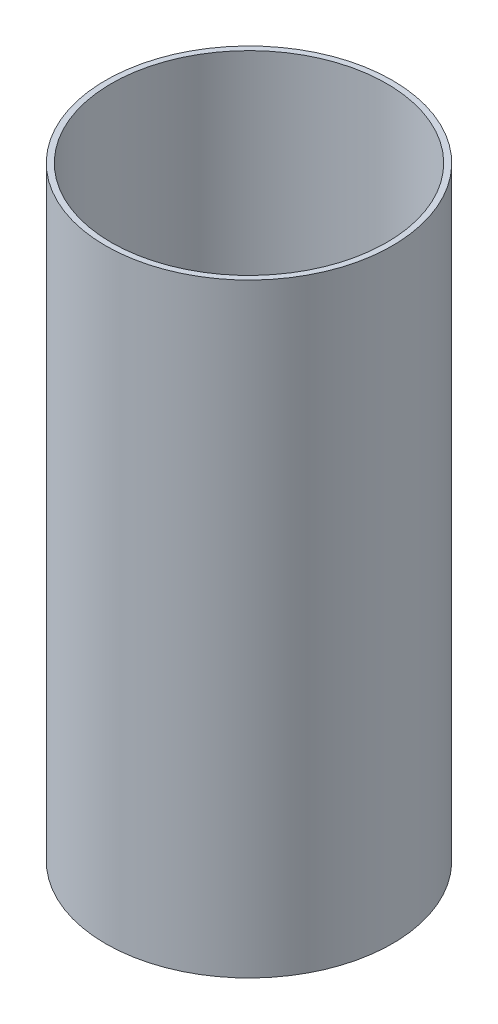
ISO-10303-21;
HEADER;
FILE_DESCRIPTION(('STEP AP214'),'2;1');
FILE_NAME('part.step','',(''),(''),'','','');
FILE_SCHEMA(('AUTOMOTIVE_DESIGN { 1 0 10303 214 1 1 1 1 }'));
ENDSEC;
DATA;
#1=APPLICATION_CONTEXT('core data for automotive mechanical design processes');
#2=APPLICATION_PROTOCOL_DEFINITION('international standard','automotive_design',2000,#1);
#3=PRODUCT_CONTEXT('',#1,'mechanical');
#4=PRODUCT('Part','Part','',(#3));
#5=PRODUCT_RELATED_PRODUCT_CATEGORY('part','',(#4));
#6=PRODUCT_DEFINITION_FORMATION('','',#4);
#7=PRODUCT_DEFINITION_CONTEXT('part definition',#1,'design');
#8=PRODUCT_DEFINITION('design','',#6,#7);
#9=PRODUCT_DEFINITION_SHAPE('','',#8);
#10=(LENGTH_UNIT() NAMED_UNIT(*) SI_UNIT(.MILLI.,.METRE.));
#11=(NAMED_UNIT(*) PLANE_ANGLE_UNIT() SI_UNIT($,.RADIAN.));
#12=(NAMED_UNIT(*) SI_UNIT($,.STERADIAN.) SOLID_ANGLE_UNIT());
#13=UNCERTAINTY_MEASURE_WITH_UNIT(LENGTH_MEASURE(1.E-05),#10,'distance_accuracy_value','');
#14=(GEOMETRIC_REPRESENTATION_CONTEXT(3) GLOBAL_UNCERTAINTY_ASSIGNED_CONTEXT((#13)) GLOBAL_UNIT_ASSIGNED_CONTEXT((#10,
#11,#12)) REPRESENTATION_CONTEXT('',''));
#15=CARTESIAN_POINT('',(0.,0.,0.));
#16=DIRECTION('',(0.,0.,1.));
#17=DIRECTION('',(1.,0.,0.));
#18=AXIS2_PLACEMENT_3D('',#15,#16,#17);
#19=CARTESIAN_POINT('',(0.,160.,0.));
#20=DIRECTION('',(0.,1.,0.));
#21=DIRECTION('',(0.,0.,1.));
#22=AXIS2_PLACEMENT_3D('',#19,#20,#21);
#23=PLANE('',#22);
#24=CARTESIAN_POINT('',(0.,160.,0.));
#25=DIRECTION('',(0.,1.,0.));
#26=DIRECTION('',(0.,0.,1.));
#27=AXIS2_PLACEMENT_3D('',#24,#25,#26);
#28=CIRCLE('',#27,37.95);
#29=CARTESIAN_POINT('',(0.,160.,37.95));
#30=VERTEX_POINT('',#29);
#31=EDGE_CURVE('E10',#30,#30,#28,.T.);
#32=ORIENTED_EDGE('',*,*,#31,.T.);
#33=EDGE_LOOP('',(#32));
#34=FACE_BOUND('',#33,.T.);
#35=CARTESIAN_POINT('',(0.,160.,0.));
#36=DIRECTION('',(0.,1.,0.));
#37=DIRECTION('',(0.,0.,1.));
#38=AXIS2_PLACEMENT_3D('',#35,#36,#37);
#39=CIRCLE('',#38,36.45);
#40=CARTESIAN_POINT('',(0.,160.,36.45));
#41=VERTEX_POINT('',#40);
#42=EDGE_CURVE('E43',#41,#41,#39,.T.);
#43=ORIENTED_EDGE('',*,*,#42,.F.);
#44=EDGE_LOOP('',(#43));
#45=FACE_BOUND('',#44,.T.);
#46=ADVANCED_FACE('F32',(#34,#45),#23,.T.);
#47=CARTESIAN_POINT('',(0.,0.,0.));
#48=DIRECTION('',(0.,1.,0.));
#49=DIRECTION('',(0.,0.,1.));
#50=AXIS2_PLACEMENT_3D('',#47,#48,#49);
#51=PLANE('',#50);
#52=CARTESIAN_POINT('',(0.,0.,0.));
#53=DIRECTION('',(0.,1.,0.));
#54=DIRECTION('',(0.,0.,1.));
#55=AXIS2_PLACEMENT_3D('',#52,#53,#54);
#56=CIRCLE('',#55,37.95);
#57=CARTESIAN_POINT('',(0.,0.,37.95));
#58=VERTEX_POINT('',#57);
#59=EDGE_CURVE('E36',#58,#58,#56,.T.);
#60=ORIENTED_EDGE('',*,*,#59,.F.);
#61=EDGE_LOOP('',(#60));
#62=FACE_BOUND('',#61,.T.);
#63=CARTESIAN_POINT('',(0.,0.,0.));
#64=DIRECTION('',(0.,1.,0.));
#65=DIRECTION('',(0.,0.,1.));
#66=AXIS2_PLACEMENT_3D('',#63,#64,#65);
#67=CIRCLE('',#66,36.45);
#68=CARTESIAN_POINT('',(0.,0.,36.45));
#69=VERTEX_POINT('',#68);
#70=EDGE_CURVE('E45',#69,#69,#67,.T.);
#71=ORIENTED_EDGE('',*,*,#70,.T.);
#72=EDGE_LOOP('',(#71));
#73=FACE_BOUND('',#72,.T.);
#74=ADVANCED_FACE('F55',(#62,#73),#51,.F.);
#75=CARTESIAN_POINT('',(0.,160.,0.));
#76=DIRECTION('',(0.,-1.,0.));
#77=DIRECTION('',(0.,0.,-1.));
#78=AXIS2_PLACEMENT_3D('',#75,#76,#77);
#79=CYLINDRICAL_SURFACE('',#78,37.95);
#80=ORIENTED_EDGE('',*,*,#31,.F.);
#81=EDGE_LOOP('',(#80));
#82=FACE_BOUND('',#81,.T.);
#83=ORIENTED_EDGE('',*,*,#59,.T.);
#84=EDGE_LOOP('',(#83));
#85=FACE_BOUND('',#84,.T.);
#86=ADVANCED_FACE('F34',(#82,#85),#79,.T.);
#87=CARTESIAN_POINT('',(0.,160.,0.));
#88=DIRECTION('',(0.,-1.,0.));
#89=DIRECTION('',(0.,0.,-1.));
#90=AXIS2_PLACEMENT_3D('',#87,#88,#89);
#91=CYLINDRICAL_SURFACE('',#90,36.45);
#92=ORIENTED_EDGE('',*,*,#42,.T.);
#93=EDGE_LOOP('',(#92));
#94=FACE_BOUND('',#93,.T.);
#95=ORIENTED_EDGE('',*,*,#70,.F.);
#96=EDGE_LOOP('',(#95));
#97=FACE_BOUND('',#96,.T.);
#98=ADVANCED_FACE('F51',(#94,#97),#91,.F.);
#99=CLOSED_SHELL('',(#46,#74,#86,#98));
#100=MANIFOLD_SOLID_BREP('B2',#99);
#101=ADVANCED_BREP_SHAPE_REPRESENTATION('',(#18,#100),#14);
#102=SHAPE_DEFINITION_REPRESENTATION(#9,#101);
ENDSEC;
END-ISO-10303-21;
